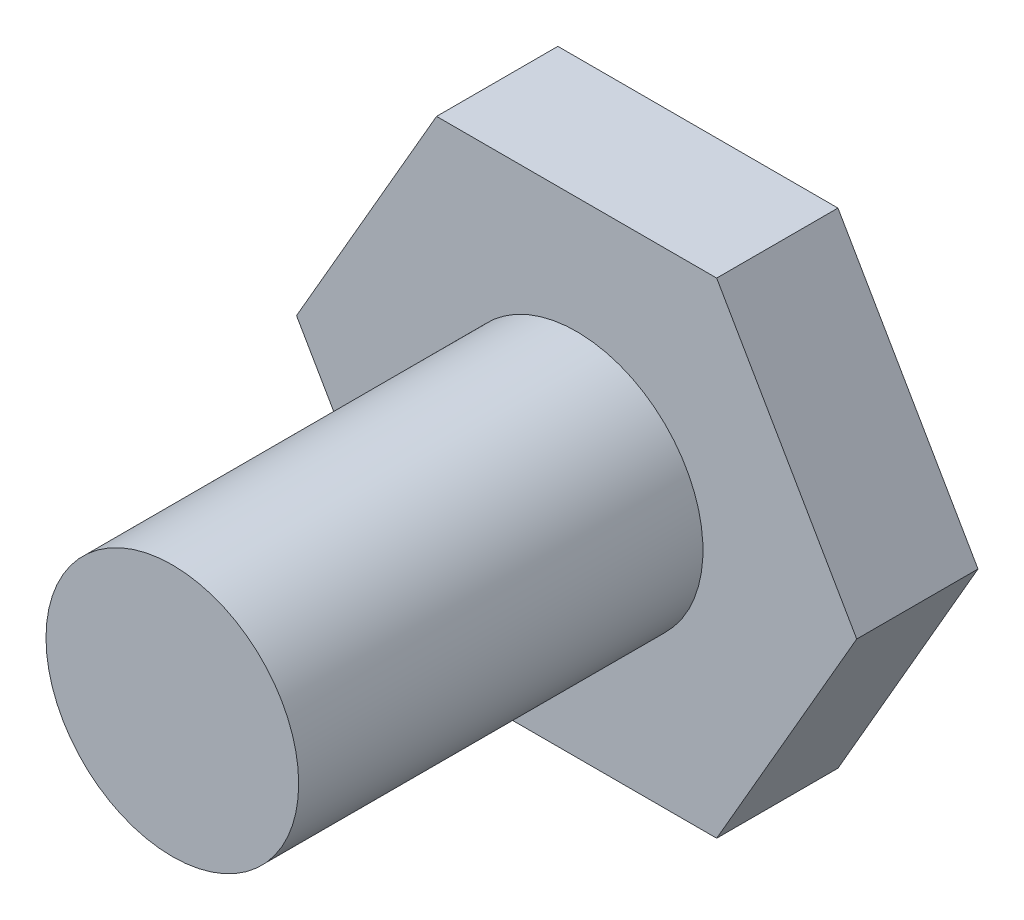
ISO-10303-21;
HEADER;
FILE_DESCRIPTION(('STEP AP214'),'2;1');
FILE_NAME('part.step','',(''),(''),'','','');
FILE_SCHEMA(('AUTOMOTIVE_DESIGN { 1 0 10303 214 1 1 1 1 }'));
ENDSEC;
DATA;
#1=APPLICATION_CONTEXT('core data for automotive mechanical design processes');
#2=APPLICATION_PROTOCOL_DEFINITION('international standard','automotive_design',2000,#1);
#3=PRODUCT_CONTEXT('',#1,'mechanical');
#4=PRODUCT('Part','Part','',(#3));
#5=PRODUCT_RELATED_PRODUCT_CATEGORY('part','',(#4));
#6=PRODUCT_DEFINITION_FORMATION('','',#4);
#7=PRODUCT_DEFINITION_CONTEXT('part definition',#1,'design');
#8=PRODUCT_DEFINITION('design','',#6,#7);
#9=PRODUCT_DEFINITION_SHAPE('','',#8);
#10=(LENGTH_UNIT() NAMED_UNIT(*) SI_UNIT(.MILLI.,.METRE.));
#11=(NAMED_UNIT(*) PLANE_ANGLE_UNIT() SI_UNIT($,.RADIAN.));
#12=(NAMED_UNIT(*) SI_UNIT($,.STERADIAN.) SOLID_ANGLE_UNIT());
#13=UNCERTAINTY_MEASURE_WITH_UNIT(LENGTH_MEASURE(1.E-05),#10,'distance_accuracy_value','');
#14=(GEOMETRIC_REPRESENTATION_CONTEXT(3) GLOBAL_UNCERTAINTY_ASSIGNED_CONTEXT((#13)) GLOBAL_UNIT_ASSIGNED_CONTEXT((#10,
#11,#12)) REPRESENTATION_CONTEXT('',''));
#15=CARTESIAN_POINT('',(0.,0.,0.));
#16=DIRECTION('',(0.,0.,1.));
#17=DIRECTION('',(1.,0.,0.));
#18=AXIS2_PLACEMENT_3D('',#15,#16,#17);
#19=CARTESIAN_POINT('',(0.,0.,100.));
#20=DIRECTION('',(0.,0.,-1.));
#21=DIRECTION('',(-1.,0.,0.));
#22=AXIS2_PLACEMENT_3D('',#19,#20,#21);
#23=CYLINDRICAL_SURFACE('',#22,31.25);
#24=CARTESIAN_POINT('',(0.,0.,100.));
#25=DIRECTION('',(0.,0.,1.));
#26=DIRECTION('',(1.,0.,0.));
#27=AXIS2_PLACEMENT_3D('',#24,#25,#26);
#28=CIRCLE('',#27,31.25);
#29=CARTESIAN_POINT('',(31.25,0.,100.));
#30=VERTEX_POINT('',#29);
#31=EDGE_CURVE('E11',#30,#30,#28,.T.);
#32=ORIENTED_EDGE('',*,*,#31,.F.);
#33=EDGE_LOOP('',(#32));
#34=FACE_BOUND('',#33,.T.);
#35=CARTESIAN_POINT('',(0.,0.,0.));
#36=DIRECTION('',(0.,0.,-1.));
#37=DIRECTION('',(-1.,0.,0.));
#38=AXIS2_PLACEMENT_3D('',#35,#36,#37);
#39=CIRCLE('',#38,31.25);
#40=CARTESIAN_POINT('',(-31.25,0.,0.));
#41=VERTEX_POINT('',#40);
#42=EDGE_CURVE('E42',#41,#41,#39,.T.);
#43=ORIENTED_EDGE('',*,*,#42,.F.);
#44=EDGE_LOOP('',(#43));
#45=FACE_BOUND('',#44,.T.);
#46=ADVANCED_FACE('F35',(#34,#45),#23,.T.);
#47=CARTESIAN_POINT('',(0.,0.,100.));
#48=DIRECTION('',(0.,0.,1.));
#49=DIRECTION('',(1.,0.,0.));
#50=AXIS2_PLACEMENT_3D('',#47,#48,#49);
#51=PLANE('',#50);
#52=ORIENTED_EDGE('',*,*,#31,.T.);
#53=EDGE_LOOP('',(#52));
#54=FACE_BOUND('',#53,.T.);
#55=ADVANCED_FACE('F158',(#54),#51,.T.);
#56=CARTESIAN_POINT('',(0.,0.,0.));
#57=DIRECTION('',(0.,0.,-1.));
#58=DIRECTION('',(-1.,0.,0.));
#59=AXIS2_PLACEMENT_3D('',#56,#57,#58);
#60=PLANE('',#59);
#61=DIRECTION('',(-0.5,0.866025403784439,0.));
#62=VECTOR('',#61,1.);
#63=CARTESIAN_POINT('',(-34.6410161513775,-60.,0.));
#64=LINE('',#63,#62);
#65=CARTESIAN_POINT('',(-34.6410161513775,-60.,0.));
#66=VERTEX_POINT('',#65);
#67=CARTESIAN_POINT('',(-69.2820323027551,0.,0.));
#68=VERTEX_POINT('',#67);
#69=EDGE_CURVE('E132',#66,#68,#64,.T.);
#70=ORIENTED_EDGE('',*,*,#69,.F.);
#71=DIRECTION('',(-1.,0.,0.));
#72=VECTOR('',#71,1.);
#73=CARTESIAN_POINT('',(34.6410161513776,-60.,0.));
#74=LINE('',#73,#72);
#75=CARTESIAN_POINT('',(34.6410161513776,-60.,0.));
#76=VERTEX_POINT('',#75);
#77=EDGE_CURVE('E85',#76,#66,#74,.T.);
#78=ORIENTED_EDGE('',*,*,#77,.F.);
#79=DIRECTION('',(-0.5,-0.866025403784439,0.));
#80=VECTOR('',#79,1.);
#81=CARTESIAN_POINT('',(69.2820323027551,0.,0.));
#82=LINE('',#81,#80);
#83=CARTESIAN_POINT('',(69.2820323027551,0.,0.));
#84=VERTEX_POINT('',#83);
#85=EDGE_CURVE('E141',#84,#76,#82,.T.);
#86=ORIENTED_EDGE('',*,*,#85,.F.);
#87=DIRECTION('',(0.5,-0.866025403784439,0.));
#88=VECTOR('',#87,1.);
#89=CARTESIAN_POINT('',(34.6410161513776,60.,0.));
#90=LINE('',#89,#88);
#91=CARTESIAN_POINT('',(34.6410161513776,60.,0.));
#92=VERTEX_POINT('',#91);
#93=EDGE_CURVE('E120',#92,#84,#90,.T.);
#94=ORIENTED_EDGE('',*,*,#93,.F.);
#95=DIRECTION('',(1.,0.,0.));
#96=VECTOR('',#95,1.);
#97=CARTESIAN_POINT('',(-34.6410161513775,60.,0.));
#98=LINE('',#97,#96);
#99=CARTESIAN_POINT('',(-34.6410161513775,60.,0.));
#100=VERTEX_POINT('',#99);
#101=EDGE_CURVE('E138',#100,#92,#98,.T.);
#102=ORIENTED_EDGE('',*,*,#101,.F.);
#103=DIRECTION('',(0.5,0.866025403784439,0.));
#104=VECTOR('',#103,1.);
#105=CARTESIAN_POINT('',(-69.2820323027551,0.,0.));
#106=LINE('',#105,#104);
#107=EDGE_CURVE('E135',#68,#100,#106,.T.);
#108=ORIENTED_EDGE('',*,*,#107,.F.);
#109=EDGE_LOOP('',(#70,#78,#86,#94,#102,#108));
#110=FACE_BOUND('',#109,.T.);
#111=ORIENTED_EDGE('',*,*,#42,.T.);
#112=EDGE_LOOP('',(#111));
#113=FACE_BOUND('',#112,.T.);
#114=ADVANCED_FACE('F155',(#110,#113),#60,.F.);
#115=CARTESIAN_POINT('',(-34.6410161513775,-60.,-30.));
#116=DIRECTION('',(0.866025403784439,0.5,0.));
#117=DIRECTION('',(-0.5,0.866025403784439,0.));
#118=AXIS2_PLACEMENT_3D('',#115,#116,#117);
#119=PLANE('',#118);
#120=ORIENTED_EDGE('',*,*,#69,.T.);
#121=DIRECTION('',(0.,0.,1.));
#122=VECTOR('',#121,1.);
#123=CARTESIAN_POINT('',(-69.2820323027551,0.,-30.));
#124=LINE('',#123,#122);
#125=CARTESIAN_POINT('',(-69.2820323027551,0.,-30.));
#126=VERTEX_POINT('',#125);
#127=EDGE_CURVE('E151',#126,#68,#124,.T.);
#128=ORIENTED_EDGE('',*,*,#127,.F.);
#129=DIRECTION('',(-0.5,0.866025403784439,0.));
#130=VECTOR('',#129,1.);
#131=CARTESIAN_POINT('',(-34.6410161513775,-60.,-30.));
#132=LINE('',#131,#130);
#133=CARTESIAN_POINT('',(-34.6410161513775,-60.,-30.));
#134=VERTEX_POINT('',#133);
#135=EDGE_CURVE('E144',#134,#126,#132,.T.);
#136=ORIENTED_EDGE('',*,*,#135,.F.);
#137=DIRECTION('',(0.,0.,1.));
#138=VECTOR('',#137,1.);
#139=CARTESIAN_POINT('',(-34.6410161513775,-60.,-30.));
#140=LINE('',#139,#138);
#141=EDGE_CURVE('E128',#134,#66,#140,.T.);
#142=ORIENTED_EDGE('',*,*,#141,.T.);
#143=EDGE_LOOP('',(#120,#128,#136,#142));
#144=FACE_BOUND('',#143,.T.);
#145=ADVANCED_FACE('F168',(#144),#119,.F.);
#146=CARTESIAN_POINT('',(-69.2820323027551,0.,-30.));
#147=DIRECTION('',(0.866025403784439,-0.5,0.));
#148=DIRECTION('',(0.5,0.866025403784439,0.));
#149=AXIS2_PLACEMENT_3D('',#146,#147,#148);
#150=PLANE('',#149);
#151=ORIENTED_EDGE('',*,*,#107,.T.);
#152=DIRECTION('',(0.,0.,1.));
#153=VECTOR('',#152,1.);
#154=CARTESIAN_POINT('',(-34.6410161513775,60.,-30.));
#155=LINE('',#154,#153);
#156=CARTESIAN_POINT('',(-34.6410161513775,60.,-30.));
#157=VERTEX_POINT('',#156);
#158=EDGE_CURVE('E148',#157,#100,#155,.T.);
#159=ORIENTED_EDGE('',*,*,#158,.F.);
#160=DIRECTION('',(0.5,0.866025403784439,0.));
#161=VECTOR('',#160,1.);
#162=CARTESIAN_POINT('',(-69.2820323027551,0.,-30.));
#163=LINE('',#162,#161);
#164=EDGE_CURVE('E94',#126,#157,#163,.T.);
#165=ORIENTED_EDGE('',*,*,#164,.F.);
#166=ORIENTED_EDGE('',*,*,#127,.T.);
#167=EDGE_LOOP('',(#151,#159,#165,#166));
#168=FACE_BOUND('',#167,.T.);
#169=ADVANCED_FACE('F174',(#168),#150,.F.);
#170=CARTESIAN_POINT('',(-34.6410161513775,60.,-30.));
#171=DIRECTION('',(0.,-1.,0.));
#172=DIRECTION('',(0.,0.,-1.));
#173=AXIS2_PLACEMENT_3D('',#170,#171,#172);
#174=PLANE('',#173);
#175=ORIENTED_EDGE('',*,*,#101,.T.);
#176=DIRECTION('',(0.,0.,1.));
#177=VECTOR('',#176,1.);
#178=CARTESIAN_POINT('',(34.6410161513776,60.,-30.));
#179=LINE('',#178,#177);
#180=CARTESIAN_POINT('',(34.6410161513776,60.,-30.));
#181=VERTEX_POINT('',#180);
#182=EDGE_CURVE('E123',#181,#92,#179,.T.);
#183=ORIENTED_EDGE('',*,*,#182,.F.);
#184=DIRECTION('',(1.,0.,0.));
#185=VECTOR('',#184,1.);
#186=CARTESIAN_POINT('',(-34.6410161513775,60.,-30.));
#187=LINE('',#186,#185);
#188=EDGE_CURVE('E111',#157,#181,#187,.T.);
#189=ORIENTED_EDGE('',*,*,#188,.F.);
#190=ORIENTED_EDGE('',*,*,#158,.T.);
#191=EDGE_LOOP('',(#175,#183,#189,#190));
#192=FACE_BOUND('',#191,.T.);
#193=ADVANCED_FACE('F178',(#192),#174,.F.);
#194=CARTESIAN_POINT('',(34.6410161513776,60.,-30.));
#195=DIRECTION('',(-0.866025403784439,-0.5,0.));
#196=DIRECTION('',(0.5,-0.866025403784439,0.));
#197=AXIS2_PLACEMENT_3D('',#194,#195,#196);
#198=PLANE('',#197);
#199=ORIENTED_EDGE('',*,*,#93,.T.);
#200=DIRECTION('',(0.,0.,1.));
#201=VECTOR('',#200,1.);
#202=CARTESIAN_POINT('',(69.2820323027551,0.,-30.));
#203=LINE('',#202,#201);
#204=CARTESIAN_POINT('',(69.2820323027551,0.,-30.));
#205=VERTEX_POINT('',#204);
#206=EDGE_CURVE('E117',#205,#84,#203,.T.);
#207=ORIENTED_EDGE('',*,*,#206,.F.);
#208=DIRECTION('',(0.5,-0.866025403784439,0.));
#209=VECTOR('',#208,1.);
#210=CARTESIAN_POINT('',(34.6410161513776,60.,-30.));
#211=LINE('',#210,#209);
#212=EDGE_CURVE('E104',#181,#205,#211,.T.);
#213=ORIENTED_EDGE('',*,*,#212,.F.);
#214=ORIENTED_EDGE('',*,*,#182,.T.);
#215=EDGE_LOOP('',(#199,#207,#213,#214));
#216=FACE_BOUND('',#215,.T.);
#217=ADVANCED_FACE('F118',(#216),#198,.F.);
#218=CARTESIAN_POINT('',(69.2820323027551,0.,-30.));
#219=DIRECTION('',(-0.866025403784439,0.5,0.));
#220=DIRECTION('',(-0.5,-0.866025403784439,0.));
#221=AXIS2_PLACEMENT_3D('',#218,#219,#220);
#222=PLANE('',#221);
#223=ORIENTED_EDGE('',*,*,#85,.T.);
#224=DIRECTION('',(0.,0.,1.));
#225=VECTOR('',#224,1.);
#226=CARTESIAN_POINT('',(34.6410161513776,-60.,-30.));
#227=LINE('',#226,#225);
#228=CARTESIAN_POINT('',(34.6410161513776,-60.,-30.));
#229=VERTEX_POINT('',#228);
#230=EDGE_CURVE('E124',#229,#76,#227,.T.);
#231=ORIENTED_EDGE('',*,*,#230,.F.);
#232=DIRECTION('',(-0.5,-0.866025403784439,0.));
#233=VECTOR('',#232,1.);
#234=CARTESIAN_POINT('',(69.2820323027551,0.,-30.));
#235=LINE('',#234,#233);
#236=EDGE_CURVE('E108',#205,#229,#235,.T.);
#237=ORIENTED_EDGE('',*,*,#236,.F.);
#238=ORIENTED_EDGE('',*,*,#206,.T.);
#239=EDGE_LOOP('',(#223,#231,#237,#238));
#240=FACE_BOUND('',#239,.T.);
#241=ADVANCED_FACE('F126',(#240),#222,.F.);
#242=CARTESIAN_POINT('',(34.6410161513776,-60.,-30.));
#243=DIRECTION('',(0.,1.,0.));
#244=DIRECTION('',(-1.,0.,0.));
#245=AXIS2_PLACEMENT_3D('',#242,#243,#244);
#246=PLANE('',#245);
#247=ORIENTED_EDGE('',*,*,#77,.T.);
#248=ORIENTED_EDGE('',*,*,#141,.F.);
#249=DIRECTION('',(-1.,0.,0.));
#250=VECTOR('',#249,1.);
#251=CARTESIAN_POINT('',(34.6410161513776,-60.,-30.));
#252=LINE('',#251,#250);
#253=EDGE_CURVE('E58',#229,#134,#252,.T.);
#254=ORIENTED_EDGE('',*,*,#253,.F.);
#255=ORIENTED_EDGE('',*,*,#230,.T.);
#256=EDGE_LOOP('',(#247,#248,#254,#255));
#257=FACE_BOUND('',#256,.T.);
#258=ADVANCED_FACE('F186',(#257),#246,.F.);
#259=CARTESIAN_POINT('',(0.,0.,-30.));
#260=DIRECTION('',(0.,0.,-1.));
#261=DIRECTION('',(-1.,0.,0.));
#262=AXIS2_PLACEMENT_3D('',#259,#260,#261);
#263=PLANE('',#262);
#264=DIRECTION('',(0.,-1.,0.));
#265=VECTOR('',#264,1.);
#266=CARTESIAN_POINT('',(14.2820323027551,45.,-30.));
#267=LINE('',#266,#265);
#268=CARTESIAN_POINT('',(14.2820323027551,45.,-30.));
#269=VERTEX_POINT('',#268);
#270=CARTESIAN_POINT('',(14.2820323027551,-45.,-30.));
#271=VERTEX_POINT('',#270);
#272=EDGE_CURVE('E49',#269,#271,#267,.T.);
#273=ORIENTED_EDGE('',*,*,#272,.F.);
#274=DIRECTION('',(1.,0.,0.));
#275=VECTOR('',#274,1.);
#276=CARTESIAN_POINT('',(14.2820323027551,45.,-30.));
#277=LINE('',#276,#275);
#278=CARTESIAN_POINT('',(-14.2820323027551,45.,-30.));
#279=VERTEX_POINT('',#278);
#280=EDGE_CURVE('E225',#279,#269,#277,.T.);
#281=ORIENTED_EDGE('',*,*,#280,.F.);
#282=DIRECTION('',(0.,1.,0.));
#283=VECTOR('',#282,1.);
#284=CARTESIAN_POINT('',(-14.2820323027551,45.,-30.));
#285=LINE('',#284,#283);
#286=CARTESIAN_POINT('',(-14.2820323027551,-45.,-30.));
#287=VERTEX_POINT('',#286);
#288=EDGE_CURVE('E230',#287,#279,#285,.T.);
#289=ORIENTED_EDGE('',*,*,#288,.F.);
#290=DIRECTION('',(-1.,0.,0.));
#291=VECTOR('',#290,1.);
#292=CARTESIAN_POINT('',(14.2820323027551,-45.,-30.));
#293=LINE('',#292,#291);
#294=EDGE_CURVE('E237',#271,#287,#293,.T.);
#295=ORIENTED_EDGE('',*,*,#294,.F.);
#296=EDGE_LOOP('',(#273,#281,#289,#295));
#297=FACE_BOUND('',#296,.T.);
#298=ORIENTED_EDGE('',*,*,#135,.T.);
#299=ORIENTED_EDGE('',*,*,#164,.T.);
#300=ORIENTED_EDGE('',*,*,#188,.T.);
#301=ORIENTED_EDGE('',*,*,#212,.T.);
#302=ORIENTED_EDGE('',*,*,#236,.T.);
#303=ORIENTED_EDGE('',*,*,#253,.T.);
#304=EDGE_LOOP('',(#298,#299,#300,#301,#302,#303));
#305=FACE_BOUND('',#304,.T.);
#306=ADVANCED_FACE('F106',(#297,#305),#263,.T.);
#307=CARTESIAN_POINT('',(14.2820323027551,45.,-10.));
#308=DIRECTION('',(1.,0.,0.));
#309=DIRECTION('',(0.,1.,0.));
#310=AXIS2_PLACEMENT_3D('',#307,#308,#309);
#311=PLANE('',#310);
#312=ORIENTED_EDGE('',*,*,#272,.T.);
#313=DIRECTION('',(0.,0.,-1.));
#314=VECTOR('',#313,1.);
#315=CARTESIAN_POINT('',(14.2820323027551,-45.,-10.));
#316=LINE('',#315,#314);
#317=CARTESIAN_POINT('',(14.2820323027551,-45.,-10.));
#318=VERTEX_POINT('',#317);
#319=EDGE_CURVE('E235',#318,#271,#316,.T.);
#320=ORIENTED_EDGE('',*,*,#319,.F.);
#321=DIRECTION('',(0.,-1.,0.));
#322=VECTOR('',#321,1.);
#323=CARTESIAN_POINT('',(14.2820323027551,45.,-10.));
#324=LINE('',#323,#322);
#325=CARTESIAN_POINT('',(14.2820323027551,45.,-10.));
#326=VERTEX_POINT('',#325);
#327=EDGE_CURVE('E217',#326,#318,#324,.T.);
#328=ORIENTED_EDGE('',*,*,#327,.F.);
#329=DIRECTION('',(0.,0.,-1.));
#330=VECTOR('',#329,1.);
#331=CARTESIAN_POINT('',(14.2820323027551,45.,-10.));
#332=LINE('',#331,#330);
#333=EDGE_CURVE('E136',#326,#269,#332,.T.);
#334=ORIENTED_EDGE('',*,*,#333,.T.);
#335=EDGE_LOOP('',(#312,#320,#328,#334));
#336=FACE_BOUND('',#335,.T.);
#337=ADVANCED_FACE('F191',(#336),#311,.F.);
#338=CARTESIAN_POINT('',(14.2820323027551,45.,-10.));
#339=DIRECTION('',(0.,1.,0.));
#340=DIRECTION('',(0.,0.,1.));
#341=AXIS2_PLACEMENT_3D('',#338,#339,#340);
#342=PLANE('',#341);
#343=ORIENTED_EDGE('',*,*,#280,.T.);
#344=ORIENTED_EDGE('',*,*,#333,.F.);
#345=DIRECTION('',(1.,0.,0.));
#346=VECTOR('',#345,1.);
#347=CARTESIAN_POINT('',(14.2820323027551,45.,-10.));
#348=LINE('',#347,#346);
#349=CARTESIAN_POINT('',(-14.2820323027551,45.,-10.));
#350=VERTEX_POINT('',#349);
#351=EDGE_CURVE('E223',#350,#326,#348,.T.);
#352=ORIENTED_EDGE('',*,*,#351,.F.);
#353=DIRECTION('',(0.,0.,-1.));
#354=VECTOR('',#353,1.);
#355=CARTESIAN_POINT('',(-14.2820323027551,45.,-10.));
#356=LINE('',#355,#354);
#357=EDGE_CURVE('E243',#350,#279,#356,.T.);
#358=ORIENTED_EDGE('',*,*,#357,.T.);
#359=EDGE_LOOP('',(#343,#344,#352,#358));
#360=FACE_BOUND('',#359,.T.);
#361=ADVANCED_FACE('F195',(#360),#342,.F.);
#362=CARTESIAN_POINT('',(-14.2820323027551,45.,-10.));
#363=DIRECTION('',(-1.,0.,0.));
#364=DIRECTION('',(0.,-1.,0.));
#365=AXIS2_PLACEMENT_3D('',#362,#363,#364);
#366=PLANE('',#365);
#367=ORIENTED_EDGE('',*,*,#288,.T.);
#368=ORIENTED_EDGE('',*,*,#357,.F.);
#369=DIRECTION('',(0.,1.,0.));
#370=VECTOR('',#369,1.);
#371=CARTESIAN_POINT('',(-14.2820323027551,45.,-10.));
#372=LINE('',#371,#370);
#373=CARTESIAN_POINT('',(-14.2820323027551,-45.,-10.));
#374=VERTEX_POINT('',#373);
#375=EDGE_CURVE('E227',#374,#350,#372,.T.);
#376=ORIENTED_EDGE('',*,*,#375,.F.);
#377=DIRECTION('',(0.,0.,-1.));
#378=VECTOR('',#377,1.);
#379=CARTESIAN_POINT('',(-14.2820323027551,-45.,-10.));
#380=LINE('',#379,#378);
#381=EDGE_CURVE('E246',#374,#287,#380,.T.);
#382=ORIENTED_EDGE('',*,*,#381,.T.);
#383=EDGE_LOOP('',(#367,#368,#376,#382));
#384=FACE_BOUND('',#383,.T.);
#385=ADVANCED_FACE('F200',(#384),#366,.F.);
#386=CARTESIAN_POINT('',(14.2820323027551,-45.,-10.));
#387=DIRECTION('',(0.,-1.,0.));
#388=DIRECTION('',(0.,0.,-1.));
#389=AXIS2_PLACEMENT_3D('',#386,#387,#388);
#390=PLANE('',#389);
#391=ORIENTED_EDGE('',*,*,#294,.T.);
#392=ORIENTED_EDGE('',*,*,#381,.F.);
#393=DIRECTION('',(-1.,0.,0.));
#394=VECTOR('',#393,1.);
#395=CARTESIAN_POINT('',(14.2820323027551,-45.,-10.));
#396=LINE('',#395,#394);
#397=EDGE_CURVE('E221',#318,#374,#396,.T.);
#398=ORIENTED_EDGE('',*,*,#397,.F.);
#399=ORIENTED_EDGE('',*,*,#319,.T.);
#400=EDGE_LOOP('',(#391,#392,#398,#399));
#401=FACE_BOUND('',#400,.T.);
#402=ADVANCED_FACE('F196',(#401),#390,.F.);
#403=CARTESIAN_POINT('',(0.,0.,-10.));
#404=DIRECTION('',(0.,0.,-1.));
#405=DIRECTION('',(-1.,0.,0.));
#406=AXIS2_PLACEMENT_3D('',#403,#404,#405);
#407=PLANE('',#406);
#408=ORIENTED_EDGE('',*,*,#327,.T.);
#409=ORIENTED_EDGE('',*,*,#397,.T.);
#410=ORIENTED_EDGE('',*,*,#375,.T.);
#411=ORIENTED_EDGE('',*,*,#351,.T.);
#412=EDGE_LOOP('',(#408,#409,#410,#411));
#413=FACE_BOUND('',#412,.T.);
#414=ADVANCED_FACE('F199',(#413),#407,.T.);
#415=CLOSED_SHELL('',(#46,#55,#114,#145,#169,#193,#217,#241,#258,#306,#337,#361,#385,#402,#414));
#416=MANIFOLD_SOLID_BREP('B2',#415);
#417=ADVANCED_BREP_SHAPE_REPRESENTATION('',(#18,#416),#14);
#418=SHAPE_DEFINITION_REPRESENTATION(#9,#417);
ENDSEC;
END-ISO-10303-21;
